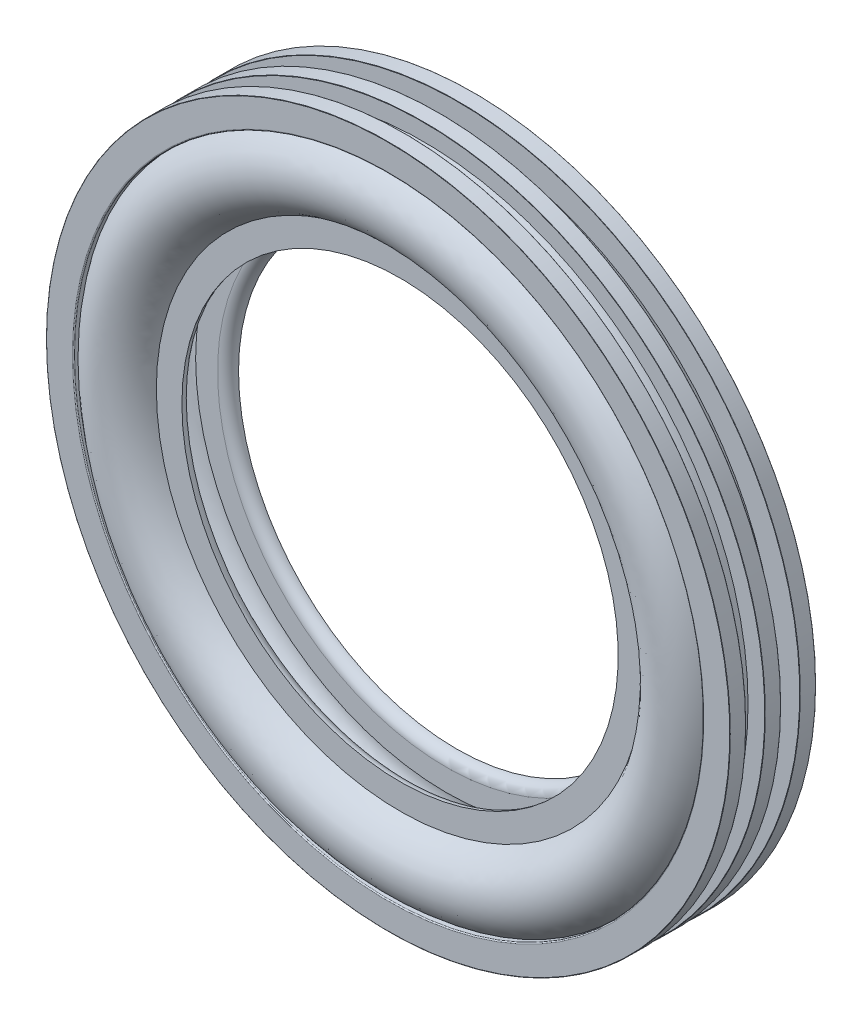
ISO-10303-21;
HEADER;
FILE_DESCRIPTION(('STEP AP214'),'2;1');
FILE_NAME('part.step','',(''),(''),'','','');
FILE_SCHEMA(('AUTOMOTIVE_DESIGN { 1 0 10303 214 1 1 1 1 }'));
ENDSEC;
DATA;
#1=APPLICATION_CONTEXT('core data for automotive mechanical design processes');
#2=APPLICATION_PROTOCOL_DEFINITION('international standard','automotive_design',2000,#1);
#3=PRODUCT_CONTEXT('',#1,'mechanical');
#4=PRODUCT('Part','Part','',(#3));
#5=PRODUCT_RELATED_PRODUCT_CATEGORY('part','',(#4));
#6=PRODUCT_DEFINITION_FORMATION('','',#4);
#7=PRODUCT_DEFINITION_CONTEXT('part definition',#1,'design');
#8=PRODUCT_DEFINITION('design','',#6,#7);
#9=PRODUCT_DEFINITION_SHAPE('','',#8);
#10=(LENGTH_UNIT() NAMED_UNIT(*) SI_UNIT(.MILLI.,.METRE.));
#11=(NAMED_UNIT(*) PLANE_ANGLE_UNIT() SI_UNIT($,.RADIAN.));
#12=(NAMED_UNIT(*) SI_UNIT($,.STERADIAN.) SOLID_ANGLE_UNIT());
#13=UNCERTAINTY_MEASURE_WITH_UNIT(LENGTH_MEASURE(1.E-05),#10,'distance_accuracy_value','');
#14=(GEOMETRIC_REPRESENTATION_CONTEXT(3) GLOBAL_UNCERTAINTY_ASSIGNED_CONTEXT((#13)) GLOBAL_UNIT_ASSIGNED_CONTEXT((#10,
#11,#12)) REPRESENTATION_CONTEXT('',''));
#15=CARTESIAN_POINT('',(0.,0.,0.));
#16=DIRECTION('',(0.,0.,1.));
#17=DIRECTION('',(1.,0.,0.));
#18=AXIS2_PLACEMENT_3D('',#15,#16,#17);
#19=CARTESIAN_POINT('',(-402.,0.,0.));
#20=DIRECTION('',(0.,-1.,0.));
#21=DIRECTION('',(0.,0.,1.));
#22=AXIS2_PLACEMENT_3D('',#19,#20,#21);
#23=ELLIPSE('',#22,76.5,63.);
#24=CARTESIAN_POINT('',(0.,0.,0.));
#25=DIRECTION('',(0.,0.,-1.));
#26=AXIS1_PLACEMENT('',#24,#25);
#27=SURFACE_OF_REVOLUTION('',#23,#26);
#28=CARTESIAN_POINT('',(0.,0.,7.5));
#29=DIRECTION('',(0.,0.,-1.));
#30=DIRECTION('',(-1.,0.,0.));
#31=AXIS2_PLACEMENT_3D('',#28,#29,#30);
#32=CIRCLE('',#31,464.696500788104);
#33=CARTESIAN_POINT('',(-464.696500788104,0.,7.5));
#34=VERTEX_POINT('',#33);
#35=EDGE_CURVE('E99',#34,#34,#32,.T.);
#36=ORIENTED_EDGE('',*,*,#35,.F.);
#37=EDGE_LOOP('',(#36));
#38=FACE_BOUND('',#37,.T.);
#39=CARTESIAN_POINT('',(0.,0.,35.));
#40=DIRECTION('',(0.,0.,-1.));
#41=DIRECTION('',(-1.,0.,0.));
#42=AXIS2_PLACEMENT_3D('',#39,#40,#41);
#43=CIRCLE('',#42,458.019676473978);
#44=CARTESIAN_POINT('',(-458.019676473978,0.,35.));
#45=VERTEX_POINT('',#44);
#46=EDGE_CURVE('E90',#45,#45,#43,.F.);
#47=ORIENTED_EDGE('',*,*,#46,.F.);
#48=EDGE_LOOP('',(#47));
#49=FACE_BOUND('',#48,.T.);
#50=ADVANCED_FACE('F34',(#38,#49),#27,.T.);
#51=CARTESIAN_POINT('',(0.,0.,40.5));
#52=DIRECTION('',(0.,0.,-1.));
#53=DIRECTION('',(-1.,0.,0.));
#54=AXIS2_PLACEMENT_3D('',#51,#52,#53);
#55=CIRCLE('',#54,348.553004622534);
#56=CARTESIAN_POINT('',(-348.553004622534,0.,40.5));
#57=VERTEX_POINT('',#56);
#58=EDGE_CURVE('E115',#57,#57,#55,.T.);
#59=ORIENTED_EDGE('',*,*,#58,.T.);
#60=EDGE_LOOP('',(#59));
#61=FACE_BOUND('',#60,.T.);
#62=CARTESIAN_POINT('',(0.,0.,49.5482139961092));
#63=DIRECTION('',(0.,0.,-1.));
#64=DIRECTION('',(-1.,0.,0.));
#65=AXIS2_PLACEMENT_3D('',#62,#63,#64);
#66=CIRCLE('',#65,449.999999999999);
#67=CARTESIAN_POINT('',(-449.999999999999,0.,49.5482139961092));
#68=VERTEX_POINT('',#67);
#69=EDGE_CURVE('E93',#68,#68,#66,.T.);
#70=ORIENTED_EDGE('',*,*,#69,.F.);
#71=EDGE_LOOP('',(#70));
#72=FACE_BOUND('',#71,.T.);
#73=ADVANCED_FACE('F197',(#61,#72),#27,.T.);
#74=CARTESIAN_POINT('',(0.,0.,-42.5));
#75=DIRECTION('',(0.,0.,-1.));
#76=DIRECTION('',(-1.,0.,0.));
#77=AXIS2_PLACEMENT_3D('',#74,#75,#76);
#78=CIRCLE('',#77,454.383203414835);
#79=CARTESIAN_POINT('',(-454.383203414835,0.,-42.5));
#80=VERTEX_POINT('',#79);
#81=EDGE_CURVE('E105',#80,#80,#78,.T.);
#82=ORIENTED_EDGE('',*,*,#81,.F.);
#83=EDGE_LOOP('',(#82));
#84=FACE_BOUND('',#83,.T.);
#85=CARTESIAN_POINT('',(0.,0.,-15.));
#86=DIRECTION('',(0.,0.,-1.));
#87=DIRECTION('',(-1.,0.,0.));
#88=AXIS2_PLACEMENT_3D('',#85,#86,#87);
#89=CIRCLE('',#88,463.777057588482);
#90=CARTESIAN_POINT('',(-463.777057588482,0.,-15.));
#91=VERTEX_POINT('',#90);
#92=EDGE_CURVE('E96',#91,#91,#89,.F.);
#93=ORIENTED_EDGE('',*,*,#92,.F.);
#94=EDGE_LOOP('',(#93));
#95=FACE_BOUND('',#94,.T.);
#96=ADVANCED_FACE('F138',(#84,#95),#27,.T.);
#97=CARTESIAN_POINT('',(0.,0.,-40.5));
#98=DIRECTION('',(0.,0.,-1.));
#99=DIRECTION('',(-1.,0.,0.));
#100=AXIS2_PLACEMENT_3D('',#97,#98,#99);
#101=CIRCLE('',#100,348.553004622534);
#102=CARTESIAN_POINT('',(-348.553004622534,0.,-40.5));
#103=VERTEX_POINT('',#102);
#104=EDGE_CURVE('E123',#103,#103,#101,.T.);
#105=ORIENTED_EDGE('',*,*,#104,.F.);
#106=EDGE_LOOP('',(#105));
#107=FACE_BOUND('',#106,.T.);
#108=CARTESIAN_POINT('',(0.,0.,-49.5482139961077));
#109=DIRECTION('',(0.,0.,-1.));
#110=DIRECTION('',(-1.,0.,0.));
#111=AXIS2_PLACEMENT_3D('',#108,#109,#110);
#112=CIRCLE('',#111,450.);
#113=CARTESIAN_POINT('',(-450.,0.,-49.5482139961077));
#114=VERTEX_POINT('',#113);
#115=EDGE_CURVE('E102',#114,#114,#112,.F.);
#116=ORIENTED_EDGE('',*,*,#115,.F.);
#117=EDGE_LOOP('',(#116));
#118=FACE_BOUND('',#117,.T.);
#119=ADVANCED_FACE('F132',(#107,#118),#27,.T.);
#120=CARTESIAN_POINT('',(-348.553004622534,0.,25.5));
#121=DIRECTION('',(0.,0.,-1.));
#122=DIRECTION('',(-1.,0.,0.));
#123=AXIS2_PLACEMENT_3D('',#120,#121,#122);
#124=PLANE('',#123);
#125=CARTESIAN_POINT('',(0.,0.,25.5));
#126=DIRECTION('',(0.,0.,-1.));
#127=DIRECTION('',(-1.,0.,0.));
#128=AXIS2_PLACEMENT_3D('',#125,#126,#127);
#129=CIRCLE('',#128,327.);
#130=CARTESIAN_POINT('',(-327.,0.,25.5));
#131=VERTEX_POINT('',#130);
#132=EDGE_CURVE('E108',#131,#131,#129,.F.);
#133=ORIENTED_EDGE('',*,*,#132,.T.);
#134=EDGE_LOOP('',(#133));
#135=FACE_BOUND('',#134,.T.);
#136=CARTESIAN_POINT('',(0.,0.,25.5));
#137=DIRECTION('',(0.,0.,-1.));
#138=DIRECTION('',(-1.,0.,0.));
#139=AXIS2_PLACEMENT_3D('',#136,#137,#138);
#140=CIRCLE('',#139,358.36596179555);
#141=CARTESIAN_POINT('',(-358.36596179555,0.,25.5));
#142=VERTEX_POINT('',#141);
#143=EDGE_CURVE('E114',#142,#142,#140,.T.);
#144=ORIENTED_EDGE('',*,*,#143,.T.);
#145=EDGE_LOOP('',(#144));
#146=FACE_BOUND('',#145,.T.);
#147=ADVANCED_FACE('F137',(#135,#146),#124,.T.);
#148=CARTESIAN_POINT('',(0.,0.,0.));
#149=DIRECTION('',(0.,0.,-1.));
#150=AXIS1_PLACEMENT('',#148,#149);
#151=SURFACE_OF_REVOLUTION('',#23,#150);
#152=OFFSET_SURFACE('',#151,-15.,.F.);
#153=CARTESIAN_POINT('',(0.,0.,-25.5));
#154=DIRECTION('',(0.,0.,-1.));
#155=DIRECTION('',(-1.,0.,0.));
#156=AXIS2_PLACEMENT_3D('',#153,#154,#155);
#157=CIRCLE('',#156,358.36596179555);
#158=CARTESIAN_POINT('',(-358.36596179555,0.,-25.5));
#159=VERTEX_POINT('',#158);
#160=EDGE_CURVE('E122',#159,#159,#157,.T.);
#161=ORIENTED_EDGE('',*,*,#160,.T.);
#162=EDGE_LOOP('',(#161));
#163=FACE_BOUND('',#162,.T.);
#164=ORIENTED_EDGE('',*,*,#143,.F.);
#165=EDGE_LOOP('',(#164));
#166=FACE_BOUND('',#165,.T.);
#167=ADVANCED_FACE('F140',(#163,#166),#152,.F.);
#168=CARTESIAN_POINT('',(-348.553004622534,0.,-25.5));
#169=DIRECTION('',(0.,0.,1.));
#170=DIRECTION('',(1.,0.,0.));
#171=AXIS2_PLACEMENT_3D('',#168,#169,#170);
#172=PLANE('',#171);
#173=CARTESIAN_POINT('',(0.,0.,-25.5));
#174=DIRECTION('',(0.,0.,1.));
#175=DIRECTION('',(1.,0.,0.));
#176=AXIS2_PLACEMENT_3D('',#173,#174,#175);
#177=CIRCLE('',#176,327.);
#178=CARTESIAN_POINT('',(327.,0.,-25.5));
#179=VERTEX_POINT('',#178);
#180=EDGE_CURVE('E111',#179,#179,#177,.F.);
#181=ORIENTED_EDGE('',*,*,#180,.T.);
#182=EDGE_LOOP('',(#181));
#183=FACE_BOUND('',#182,.T.);
#184=ORIENTED_EDGE('',*,*,#160,.F.);
#185=EDGE_LOOP('',(#184));
#186=FACE_BOUND('',#185,.T.);
#187=ADVANCED_FACE('F142',(#183,#186),#172,.T.);
#188=CARTESIAN_POINT('',(-348.553004622534,0.,40.5));
#189=DIRECTION('',(0.,0.,-1.));
#190=DIRECTION('',(-1.,0.,0.));
#191=AXIS2_PLACEMENT_3D('',#188,#189,#190);
#192=PLANE('',#191);
#193=ORIENTED_EDGE('',*,*,#58,.F.);
#194=EDGE_LOOP('',(#193));
#195=FACE_BOUND('',#194,.T.);
#196=CARTESIAN_POINT('',(0.,0.,40.5));
#197=DIRECTION('',(0.,0.,-1.));
#198=DIRECTION('',(-1.,0.,0.));
#199=AXIS2_PLACEMENT_3D('',#196,#197,#198);
#200=CIRCLE('',#199,312.);
#201=CARTESIAN_POINT('',(-312.,0.,40.5));
#202=VERTEX_POINT('',#201);
#203=EDGE_CURVE('E118',#202,#202,#200,.T.);
#204=ORIENTED_EDGE('',*,*,#203,.T.);
#205=EDGE_LOOP('',(#204));
#206=FACE_BOUND('',#205,.T.);
#207=ADVANCED_FACE('F145',(#195,#206),#192,.F.);
#208=CARTESIAN_POINT('',(-348.553004622534,0.,-40.5));
#209=DIRECTION('',(0.,0.,1.));
#210=DIRECTION('',(1.,0.,0.));
#211=AXIS2_PLACEMENT_3D('',#208,#209,#210);
#212=PLANE('',#211);
#213=CARTESIAN_POINT('',(0.,0.,-40.5));
#214=DIRECTION('',(0.,0.,-1.));
#215=DIRECTION('',(-1.,0.,0.));
#216=AXIS2_PLACEMENT_3D('',#213,#214,#215);
#217=CIRCLE('',#216,312.);
#218=CARTESIAN_POINT('',(-312.,0.,-40.5));
#219=VERTEX_POINT('',#218);
#220=EDGE_CURVE('E119',#219,#219,#217,.T.);
#221=ORIENTED_EDGE('',*,*,#220,.F.);
#222=EDGE_LOOP('',(#221));
#223=FACE_BOUND('',#222,.T.);
#224=ORIENTED_EDGE('',*,*,#104,.T.);
#225=EDGE_LOOP('',(#224));
#226=FACE_BOUND('',#225,.T.);
#227=ADVANCED_FACE('F147',(#223,#226),#212,.F.);
#228=CARTESIAN_POINT('',(0.,0.,-40.5));
#229=DIRECTION('',(0.,0.,1.));
#230=DIRECTION('',(1.,0.,0.));
#231=AXIS2_PLACEMENT_3D('',#228,#229,#230);
#232=TOROIDAL_SURFACE('',#231,327.,15.);
#233=ORIENTED_EDGE('',*,*,#220,.T.);
#234=EDGE_LOOP('',(#233));
#235=FACE_BOUND('',#234,.T.);
#236=ORIENTED_EDGE('',*,*,#180,.F.);
#237=EDGE_LOOP('',(#236));
#238=FACE_BOUND('',#237,.T.);
#239=ADVANCED_FACE('F150',(#235,#238),#232,.T.);
#240=CARTESIAN_POINT('',(0.,0.,40.5));
#241=DIRECTION('',(0.,0.,-1.));
#242=DIRECTION('',(-1.,0.,0.));
#243=AXIS2_PLACEMENT_3D('',#240,#241,#242);
#244=TOROIDAL_SURFACE('',#243,327.,15.);
#245=ORIENTED_EDGE('',*,*,#132,.F.);
#246=EDGE_LOOP('',(#245));
#247=FACE_BOUND('',#246,.T.);
#248=ORIENTED_EDGE('',*,*,#203,.F.);
#249=EDGE_LOOP('',(#248));
#250=FACE_BOUND('',#249,.T.);
#251=ADVANCED_FACE('F157',(#247,#250),#244,.T.);
#252=CARTESIAN_POINT('',(0.,0.,0.));
#253=DIRECTION('',(0.,0.,1.));
#254=DIRECTION('',(1.,0.,0.));
#255=AXIS2_PLACEMENT_3D('',#252,#253,#254);
#256=CYLINDRICAL_SURFACE('',#255,450.);
#257=CARTESIAN_POINT('',(0.,0.,-63.5));
#258=DIRECTION('',(0.,0.,1.));
#259=DIRECTION('',(1.,0.,0.));
#260=AXIS2_PLACEMENT_3D('',#257,#258,#259);
#261=CIRCLE('',#260,450.);
#262=CARTESIAN_POINT('',(450.,0.,-63.5));
#263=VERTEX_POINT('',#262);
#264=EDGE_CURVE('E10',#263,#263,#261,.F.);
#265=ORIENTED_EDGE('',*,*,#264,.T.);
#266=EDGE_LOOP('',(#265));
#267=FACE_BOUND('',#266,.T.);
#268=ORIENTED_EDGE('',*,*,#115,.T.);
#269=EDGE_LOOP('',(#268));
#270=FACE_BOUND('',#269,.T.);
#271=ADVANCED_FACE('F161',(#267,#270),#256,.F.);
#272=CARTESIAN_POINT('',(0.,0.,0.));
#273=DIRECTION('',(0.,0.,1.));
#274=DIRECTION('',(1.,0.,0.));
#275=AXIS2_PLACEMENT_3D('',#272,#273,#274);
#276=CYLINDRICAL_SURFACE('',#275,489.);
#277=CARTESIAN_POINT('',(0.,0.,-64.625));
#278=DIRECTION('',(0.,0.,1.));
#279=DIRECTION('',(1.,0.,0.));
#280=AXIS2_PLACEMENT_3D('',#277,#278,#279);
#281=CIRCLE('',#280,489.);
#282=CARTESIAN_POINT('',(489.,0.,-64.625));
#283=VERTEX_POINT('',#282);
#284=EDGE_CURVE('E72',#283,#283,#281,.T.);
#285=ORIENTED_EDGE('',*,*,#284,.T.);
#286=EDGE_LOOP('',(#285));
#287=FACE_BOUND('',#286,.T.);
#288=CARTESIAN_POINT('',(0.,0.,-42.875));
#289=DIRECTION('',(0.,0.,-1.));
#290=DIRECTION('',(-1.,0.,0.));
#291=AXIS2_PLACEMENT_3D('',#288,#289,#290);
#292=CIRCLE('',#291,489.);
#293=CARTESIAN_POINT('',(-489.,0.,-42.875));
#294=VERTEX_POINT('',#293);
#295=EDGE_CURVE('E75',#294,#294,#292,.T.);
#296=ORIENTED_EDGE('',*,*,#295,.T.);
#297=EDGE_LOOP('',(#296));
#298=FACE_BOUND('',#297,.T.);
#299=ADVANCED_FACE('F242',(#287,#298),#276,.T.);
#300=CARTESIAN_POINT('',(-450.,0.,-65.));
#301=DIRECTION('',(0.,0.,1.));
#302=DIRECTION('',(1.,0.,0.));
#303=AXIS2_PLACEMENT_3D('',#300,#301,#302);
#304=PLANE('',#303);
#305=CARTESIAN_POINT('',(0.,0.,-65.));
#306=DIRECTION('',(0.,0.,1.));
#307=DIRECTION('',(1.,0.,0.));
#308=AXIS2_PLACEMENT_3D('',#305,#306,#307);
#309=CIRCLE('',#308,451.5);
#310=CARTESIAN_POINT('',(451.5,0.,-65.));
#311=VERTEX_POINT('',#310);
#312=EDGE_CURVE('E41',#311,#311,#309,.T.);
#313=ORIENTED_EDGE('',*,*,#312,.T.);
#314=EDGE_LOOP('',(#313));
#315=FACE_BOUND('',#314,.T.);
#316=CARTESIAN_POINT('',(0.,0.,-65.));
#317=DIRECTION('',(0.,0.,1.));
#318=DIRECTION('',(1.,0.,0.));
#319=AXIS2_PLACEMENT_3D('',#316,#317,#318);
#320=CIRCLE('',#319,488.625);
#321=CARTESIAN_POINT('',(488.625,0.,-65.));
#322=VERTEX_POINT('',#321);
#323=EDGE_CURVE('E69',#322,#322,#320,.F.);
#324=ORIENTED_EDGE('',*,*,#323,.T.);
#325=EDGE_LOOP('',(#324));
#326=FACE_BOUND('',#325,.T.);
#327=ADVANCED_FACE('F238',(#315,#326),#304,.F.);
#328=CARTESIAN_POINT('',(-450.,0.,-42.5));
#329=DIRECTION('',(0.,0.,-1.));
#330=DIRECTION('',(-1.,0.,0.));
#331=AXIS2_PLACEMENT_3D('',#328,#329,#330);
#332=PLANE('',#331);
#333=CARTESIAN_POINT('',(0.,0.,-42.5));
#334=DIRECTION('',(0.,0.,-1.));
#335=DIRECTION('',(-1.,0.,0.));
#336=AXIS2_PLACEMENT_3D('',#333,#334,#335);
#337=CIRCLE('',#336,488.625);
#338=CARTESIAN_POINT('',(-488.625,0.,-42.5));
#339=VERTEX_POINT('',#338);
#340=EDGE_CURVE('E66',#339,#339,#337,.F.);
#341=ORIENTED_EDGE('',*,*,#340,.T.);
#342=EDGE_LOOP('',(#341));
#343=FACE_BOUND('',#342,.T.);
#344=ORIENTED_EDGE('',*,*,#81,.T.);
#345=EDGE_LOOP('',(#344));
#346=FACE_BOUND('',#345,.T.);
#347=ADVANCED_FACE('F234',(#343,#346),#332,.F.);
#348=CARTESIAN_POINT('',(0.,0.,0.));
#349=DIRECTION('',(0.,0.,1.));
#350=DIRECTION('',(1.,0.,0.));
#351=AXIS2_PLACEMENT_3D('',#348,#349,#350);
#352=CYLINDRICAL_SURFACE('',#351,488.999999999999);
#353=CARTESIAN_POINT('',(0.,0.,-14.625));
#354=DIRECTION('',(0.,0.,1.));
#355=DIRECTION('',(1.,0.,0.));
#356=AXIS2_PLACEMENT_3D('',#353,#354,#355);
#357=CIRCLE('',#356,488.999999999999);
#358=CARTESIAN_POINT('',(488.999999999999,0.,-14.625));
#359=VERTEX_POINT('',#358);
#360=EDGE_CURVE('E60',#359,#359,#357,.T.);
#361=ORIENTED_EDGE('',*,*,#360,.T.);
#362=EDGE_LOOP('',(#361));
#363=FACE_BOUND('',#362,.T.);
#364=CARTESIAN_POINT('',(0.,0.,7.125));
#365=DIRECTION('',(0.,0.,-1.));
#366=DIRECTION('',(-1.,0.,0.));
#367=AXIS2_PLACEMENT_3D('',#364,#365,#366);
#368=CIRCLE('',#367,488.999999999999);
#369=CARTESIAN_POINT('',(-488.999999999999,0.,7.125));
#370=VERTEX_POINT('',#369);
#371=EDGE_CURVE('E63',#370,#370,#368,.T.);
#372=ORIENTED_EDGE('',*,*,#371,.T.);
#373=EDGE_LOOP('',(#372));
#374=FACE_BOUND('',#373,.T.);
#375=ADVANCED_FACE('F230',(#363,#374),#352,.T.);
#376=CARTESIAN_POINT('',(-449.999999999999,0.,-15.));
#377=DIRECTION('',(0.,0.,1.));
#378=DIRECTION('',(1.,0.,0.));
#379=AXIS2_PLACEMENT_3D('',#376,#377,#378);
#380=PLANE('',#379);
#381=CARTESIAN_POINT('',(0.,0.,-15.));
#382=DIRECTION('',(0.,0.,1.));
#383=DIRECTION('',(1.,0.,0.));
#384=AXIS2_PLACEMENT_3D('',#381,#382,#383);
#385=CIRCLE('',#384,488.624999999999);
#386=CARTESIAN_POINT('',(488.624999999999,0.,-15.));
#387=VERTEX_POINT('',#386);
#388=EDGE_CURVE('E57',#387,#387,#385,.F.);
#389=ORIENTED_EDGE('',*,*,#388,.T.);
#390=EDGE_LOOP('',(#389));
#391=FACE_BOUND('',#390,.T.);
#392=ORIENTED_EDGE('',*,*,#92,.T.);
#393=EDGE_LOOP('',(#392));
#394=FACE_BOUND('',#393,.T.);
#395=ADVANCED_FACE('F226',(#391,#394),#380,.F.);
#396=CARTESIAN_POINT('',(-449.999999999999,0.,7.5));
#397=DIRECTION('',(0.,0.,-1.));
#398=DIRECTION('',(-1.,0.,0.));
#399=AXIS2_PLACEMENT_3D('',#396,#397,#398);
#400=PLANE('',#399);
#401=CARTESIAN_POINT('',(0.,0.,7.5));
#402=DIRECTION('',(0.,0.,-1.));
#403=DIRECTION('',(-1.,0.,0.));
#404=AXIS2_PLACEMENT_3D('',#401,#402,#403);
#405=CIRCLE('',#404,488.624999999999);
#406=CARTESIAN_POINT('',(-488.624999999999,0.,7.5));
#407=VERTEX_POINT('',#406);
#408=EDGE_CURVE('E54',#407,#407,#405,.F.);
#409=ORIENTED_EDGE('',*,*,#408,.T.);
#410=EDGE_LOOP('',(#409));
#411=FACE_BOUND('',#410,.T.);
#412=ORIENTED_EDGE('',*,*,#35,.T.);
#413=EDGE_LOOP('',(#412));
#414=FACE_BOUND('',#413,.T.);
#415=ADVANCED_FACE('F223',(#411,#414),#400,.F.);
#416=CARTESIAN_POINT('',(0.,0.,0.));
#417=DIRECTION('',(0.,0.,1.));
#418=DIRECTION('',(1.,0.,0.));
#419=AXIS2_PLACEMENT_3D('',#416,#417,#418);
#420=CYLINDRICAL_SURFACE('',#419,449.999999999999);
#421=CARTESIAN_POINT('',(0.,0.,56.));
#422=DIRECTION('',(0.,0.,-1.));
#423=DIRECTION('',(-1.,0.,0.));
#424=AXIS2_PLACEMENT_3D('',#421,#422,#423);
#425=CIRCLE('',#424,449.999999999999);
#426=CARTESIAN_POINT('',(-449.999999999999,0.,56.));
#427=VERTEX_POINT('',#426);
#428=EDGE_CURVE('E49',#427,#427,#425,.F.);
#429=ORIENTED_EDGE('',*,*,#428,.T.);
#430=EDGE_LOOP('',(#429));
#431=FACE_BOUND('',#430,.T.);
#432=ORIENTED_EDGE('',*,*,#69,.T.);
#433=EDGE_LOOP('',(#432));
#434=FACE_BOUND('',#433,.T.);
#435=ADVANCED_FACE('F218',(#431,#434),#420,.F.);
#436=CARTESIAN_POINT('',(0.,0.,0.));
#437=DIRECTION('',(0.,0.,1.));
#438=DIRECTION('',(1.,0.,0.));
#439=AXIS2_PLACEMENT_3D('',#436,#437,#438);
#440=CYLINDRICAL_SURFACE('',#439,488.999999999999);
#441=CARTESIAN_POINT('',(0.,0.,35.375));
#442=DIRECTION('',(0.,0.,1.));
#443=DIRECTION('',(1.,0.,0.));
#444=AXIS2_PLACEMENT_3D('',#441,#442,#443);
#445=CIRCLE('',#444,488.999999999999);
#446=CARTESIAN_POINT('',(488.999999999999,0.,35.375));
#447=VERTEX_POINT('',#446);
#448=EDGE_CURVE('E84',#447,#447,#445,.T.);
#449=ORIENTED_EDGE('',*,*,#448,.T.);
#450=EDGE_LOOP('',(#449));
#451=FACE_BOUND('',#450,.T.);
#452=CARTESIAN_POINT('',(0.,0.,57.125));
#453=DIRECTION('',(0.,0.,-1.));
#454=DIRECTION('',(-1.,0.,0.));
#455=AXIS2_PLACEMENT_3D('',#452,#453,#454);
#456=CIRCLE('',#455,488.999999999999);
#457=CARTESIAN_POINT('',(-488.999999999999,0.,57.125));
#458=VERTEX_POINT('',#457);
#459=EDGE_CURVE('E87',#458,#458,#456,.T.);
#460=ORIENTED_EDGE('',*,*,#459,.T.);
#461=EDGE_LOOP('',(#460));
#462=FACE_BOUND('',#461,.T.);
#463=ADVANCED_FACE('F209',(#451,#462),#440,.T.);
#464=CARTESIAN_POINT('',(-449.999999999999,0.,35.));
#465=DIRECTION('',(0.,0.,1.));
#466=DIRECTION('',(1.,0.,0.));
#467=AXIS2_PLACEMENT_3D('',#464,#465,#466);
#468=PLANE('',#467);
#469=CARTESIAN_POINT('',(0.,0.,35.));
#470=DIRECTION('',(0.,0.,1.));
#471=DIRECTION('',(1.,0.,0.));
#472=AXIS2_PLACEMENT_3D('',#469,#470,#471);
#473=CIRCLE('',#472,488.624999999999);
#474=CARTESIAN_POINT('',(488.624999999999,0.,35.));
#475=VERTEX_POINT('',#474);
#476=EDGE_CURVE('E81',#475,#475,#473,.F.);
#477=ORIENTED_EDGE('',*,*,#476,.T.);
#478=EDGE_LOOP('',(#477));
#479=FACE_BOUND('',#478,.T.);
#480=ORIENTED_EDGE('',*,*,#46,.T.);
#481=EDGE_LOOP('',(#480));
#482=FACE_BOUND('',#481,.T.);
#483=ADVANCED_FACE('F207',(#479,#482),#468,.F.);
#484=CARTESIAN_POINT('',(-449.999999999999,0.,57.5));
#485=DIRECTION('',(0.,0.,-1.));
#486=DIRECTION('',(-1.,0.,0.));
#487=AXIS2_PLACEMENT_3D('',#484,#485,#486);
#488=PLANE('',#487);
#489=CARTESIAN_POINT('',(0.,0.,57.5));
#490=DIRECTION('',(0.,0.,-1.));
#491=DIRECTION('',(-1.,0.,0.));
#492=AXIS2_PLACEMENT_3D('',#489,#490,#491);
#493=CIRCLE('',#492,451.499999999999);
#494=CARTESIAN_POINT('',(-451.499999999999,0.,57.5));
#495=VERTEX_POINT('',#494);
#496=EDGE_CURVE('E45',#495,#495,#493,.T.);
#497=ORIENTED_EDGE('',*,*,#496,.T.);
#498=EDGE_LOOP('',(#497));
#499=FACE_BOUND('',#498,.T.);
#500=CARTESIAN_POINT('',(0.,0.,57.5));
#501=DIRECTION('',(0.,0.,-1.));
#502=DIRECTION('',(-1.,0.,0.));
#503=AXIS2_PLACEMENT_3D('',#500,#501,#502);
#504=CIRCLE('',#503,488.624999999999);
#505=CARTESIAN_POINT('',(-488.624999999999,0.,57.5));
#506=VERTEX_POINT('',#505);
#507=EDGE_CURVE('E78',#506,#506,#504,.F.);
#508=ORIENTED_EDGE('',*,*,#507,.T.);
#509=EDGE_LOOP('',(#508));
#510=FACE_BOUND('',#509,.T.);
#511=ADVANCED_FACE('F167',(#499,#510),#488,.F.);
#512=CARTESIAN_POINT('',(0.,0.,35.375));
#513=DIRECTION('',(0.,0.,1.));
#514=DIRECTION('',(1.,0.,0.));
#515=AXIS2_PLACEMENT_3D('',#512,#513,#514);
#516=TOROIDAL_SURFACE('',#515,488.624999999999,0.375);
#517=ORIENTED_EDGE('',*,*,#476,.F.);
#518=EDGE_LOOP('',(#517));
#519=FACE_BOUND('',#518,.T.);
#520=ORIENTED_EDGE('',*,*,#448,.F.);
#521=EDGE_LOOP('',(#520));
#522=FACE_BOUND('',#521,.T.);
#523=ADVANCED_FACE('F163',(#519,#522),#516,.T.);
#524=CARTESIAN_POINT('',(0.,0.,57.125));
#525=DIRECTION('',(0.,0.,-1.));
#526=DIRECTION('',(-1.,0.,0.));
#527=AXIS2_PLACEMENT_3D('',#524,#525,#526);
#528=TOROIDAL_SURFACE('',#527,488.624999999999,0.375);
#529=ORIENTED_EDGE('',*,*,#459,.F.);
#530=EDGE_LOOP('',(#529));
#531=FACE_BOUND('',#530,.T.);
#532=ORIENTED_EDGE('',*,*,#507,.F.);
#533=EDGE_LOOP('',(#532));
#534=FACE_BOUND('',#533,.T.);
#535=ADVANCED_FACE('F166',(#531,#534),#528,.T.);
#536=CARTESIAN_POINT('',(0.,0.,-64.625));
#537=DIRECTION('',(0.,0.,1.));
#538=DIRECTION('',(1.,0.,0.));
#539=AXIS2_PLACEMENT_3D('',#536,#537,#538);
#540=TOROIDAL_SURFACE('',#539,488.625,0.375);
#541=ORIENTED_EDGE('',*,*,#323,.F.);
#542=EDGE_LOOP('',(#541));
#543=FACE_BOUND('',#542,.T.);
#544=ORIENTED_EDGE('',*,*,#284,.F.);
#545=EDGE_LOOP('',(#544));
#546=FACE_BOUND('',#545,.T.);
#547=ADVANCED_FACE('F171',(#543,#546),#540,.T.);
#548=CARTESIAN_POINT('',(0.,0.,-42.875));
#549=DIRECTION('',(0.,0.,-1.));
#550=DIRECTION('',(-1.,0.,0.));
#551=AXIS2_PLACEMENT_3D('',#548,#549,#550);
#552=TOROIDAL_SURFACE('',#551,488.625,0.375);
#553=ORIENTED_EDGE('',*,*,#295,.F.);
#554=EDGE_LOOP('',(#553));
#555=FACE_BOUND('',#554,.T.);
#556=ORIENTED_EDGE('',*,*,#340,.F.);
#557=EDGE_LOOP('',(#556));
#558=FACE_BOUND('',#557,.T.);
#559=ADVANCED_FACE('F175',(#555,#558),#552,.T.);
#560=CARTESIAN_POINT('',(0.,0.,-14.625));
#561=DIRECTION('',(0.,0.,1.));
#562=DIRECTION('',(1.,0.,0.));
#563=AXIS2_PLACEMENT_3D('',#560,#561,#562);
#564=TOROIDAL_SURFACE('',#563,488.624999999999,0.375);
#565=ORIENTED_EDGE('',*,*,#388,.F.);
#566=EDGE_LOOP('',(#565));
#567=FACE_BOUND('',#566,.T.);
#568=ORIENTED_EDGE('',*,*,#360,.F.);
#569=EDGE_LOOP('',(#568));
#570=FACE_BOUND('',#569,.T.);
#571=ADVANCED_FACE('F179',(#567,#570),#564,.T.);
#572=CARTESIAN_POINT('',(0.,0.,7.125));
#573=DIRECTION('',(0.,0.,-1.));
#574=DIRECTION('',(-1.,0.,0.));
#575=AXIS2_PLACEMENT_3D('',#572,#573,#574);
#576=TOROIDAL_SURFACE('',#575,488.624999999999,0.375);
#577=ORIENTED_EDGE('',*,*,#371,.F.);
#578=EDGE_LOOP('',(#577));
#579=FACE_BOUND('',#578,.T.);
#580=ORIENTED_EDGE('',*,*,#408,.F.);
#581=EDGE_LOOP('',(#580));
#582=FACE_BOUND('',#581,.T.);
#583=ADVANCED_FACE('F183',(#579,#582),#576,.T.);
#584=CARTESIAN_POINT('',(0.,0.,56.));
#585=DIRECTION('',(0.,0.,-1.));
#586=DIRECTION('',(-1.,0.,0.));
#587=AXIS2_PLACEMENT_3D('',#584,#585,#586);
#588=TOROIDAL_SURFACE('',#587,451.499999999999,1.5);
#589=ORIENTED_EDGE('',*,*,#496,.F.);
#590=EDGE_LOOP('',(#589));
#591=FACE_BOUND('',#590,.T.);
#592=ORIENTED_EDGE('',*,*,#428,.F.);
#593=EDGE_LOOP('',(#592));
#594=FACE_BOUND('',#593,.T.);
#595=ADVANCED_FACE('F186',(#591,#594),#588,.T.);
#596=CARTESIAN_POINT('',(0.,0.,-63.5));
#597=DIRECTION('',(0.,0.,1.));
#598=DIRECTION('',(1.,0.,0.));
#599=AXIS2_PLACEMENT_3D('',#596,#597,#598);
#600=TOROIDAL_SURFACE('',#599,451.5,1.5);
#601=ORIENTED_EDGE('',*,*,#264,.F.);
#602=EDGE_LOOP('',(#601));
#603=FACE_BOUND('',#602,.T.);
#604=ORIENTED_EDGE('',*,*,#312,.F.);
#605=EDGE_LOOP('',(#604));
#606=FACE_BOUND('',#605,.T.);
#607=ADVANCED_FACE('F36',(#603,#606),#600,.T.);
#608=CLOSED_SHELL('',(#50,#73,#96,#119,#147,#167,#187,#207,#227,#239,#251,#271,#299,#327,#347,
#375,#395,#415,#435,#463,#483,#511,#523,#535,#547,#559,#571,#583,#595,#607));
#609=MANIFOLD_SOLID_BREP('B2',#608);
#610=ADVANCED_BREP_SHAPE_REPRESENTATION('',(#18,#609),#14);
#611=SHAPE_DEFINITION_REPRESENTATION(#9,#610);
ENDSEC;
END-ISO-10303-21;
